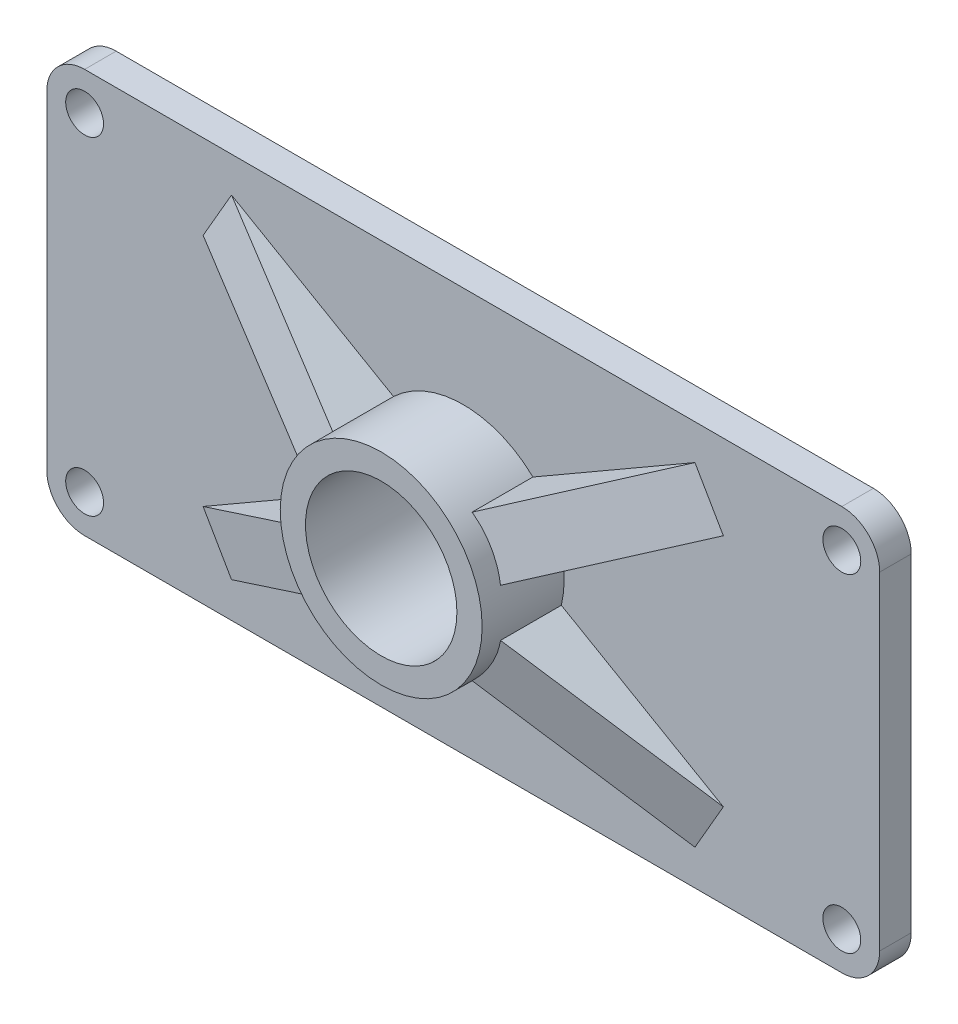
ISO-10303-21;
HEADER;
FILE_DESCRIPTION(('STEP AP214'),'2;1');
FILE_NAME('part.step','',(''),(''),'','','');
FILE_SCHEMA(('AUTOMOTIVE_DESIGN { 1 0 10303 214 1 1 1 1 }'));
ENDSEC;
DATA;
#1=APPLICATION_CONTEXT('core data for automotive mechanical design processes');
#2=APPLICATION_PROTOCOL_DEFINITION('international standard','automotive_design',2000,#1);
#3=PRODUCT_CONTEXT('',#1,'mechanical');
#4=PRODUCT('Part','Part','',(#3));
#5=PRODUCT_RELATED_PRODUCT_CATEGORY('part','',(#4));
#6=PRODUCT_DEFINITION_FORMATION('','',#4);
#7=PRODUCT_DEFINITION_CONTEXT('part definition',#1,'design');
#8=PRODUCT_DEFINITION('design','',#6,#7);
#9=PRODUCT_DEFINITION_SHAPE('','',#8);
#10=(LENGTH_UNIT() NAMED_UNIT(*) SI_UNIT(.MILLI.,.METRE.));
#11=(NAMED_UNIT(*) PLANE_ANGLE_UNIT() SI_UNIT($,.RADIAN.));
#12=(NAMED_UNIT(*) SI_UNIT($,.STERADIAN.) SOLID_ANGLE_UNIT());
#13=UNCERTAINTY_MEASURE_WITH_UNIT(LENGTH_MEASURE(1.E-05),#10,'distance_accuracy_value','');
#14=(GEOMETRIC_REPRESENTATION_CONTEXT(3) GLOBAL_UNCERTAINTY_ASSIGNED_CONTEXT((#13)) GLOBAL_UNIT_ASSIGNED_CONTEXT((#10,
#11,#12)) REPRESENTATION_CONTEXT('',''));
#15=CARTESIAN_POINT('',(0.,0.,0.));
#16=DIRECTION('',(0.,0.,1.));
#17=DIRECTION('',(1.,0.,0.));
#18=AXIS2_PLACEMENT_3D('',#15,#16,#17);
#19=CARTESIAN_POINT('',(0.,32.,5.));
#20=DIRECTION('',(0.,1.,0.));
#21=DIRECTION('',(0.,0.,1.));
#22=AXIS2_PLACEMENT_3D('',#19,#20,#21);
#23=PLANE('',#22);
#24=DIRECTION('',(0.,0.,-1.));
#25=VECTOR('',#24,1.);
#26=CARTESIAN_POINT('',(60.,32.,5.));
#27=LINE('',#26,#25);
#28=CARTESIAN_POINT('',(60.,32.,5.));
#29=VERTEX_POINT('',#28);
#30=CARTESIAN_POINT('',(60.,32.,0.));
#31=VERTEX_POINT('',#30);
#32=EDGE_CURVE('E349',#29,#31,#27,.T.);
#33=ORIENTED_EDGE('',*,*,#32,.T.);
#34=DIRECTION('',(1.,0.,0.));
#35=VECTOR('',#34,1.);
#36=CARTESIAN_POINT('',(0.,32.,0.));
#37=LINE('',#36,#35);
#38=CARTESIAN_POINT('',(-60.,32.,0.));
#39=VERTEX_POINT('',#38);
#40=EDGE_CURVE('E365',#39,#31,#37,.T.);
#41=ORIENTED_EDGE('',*,*,#40,.F.);
#42=DIRECTION('',(0.,0.,-1.));
#43=VECTOR('',#42,1.);
#44=CARTESIAN_POINT('',(-60.,32.,5.));
#45=LINE('',#44,#43);
#46=CARTESIAN_POINT('',(-60.,32.,5.));
#47=VERTEX_POINT('',#46);
#48=EDGE_CURVE('E418',#47,#39,#45,.T.);
#49=ORIENTED_EDGE('',*,*,#48,.F.);
#50=DIRECTION('',(1.,0.,0.));
#51=VECTOR('',#50,1.);
#52=CARTESIAN_POINT('',(0.,32.,5.));
#53=LINE('',#52,#51);
#54=EDGE_CURVE('E323',#47,#29,#53,.T.);
#55=ORIENTED_EDGE('',*,*,#54,.T.);
#56=EDGE_LOOP('',(#33,#41,#49,#55));
#57=FACE_BOUND('',#56,.T.);
#58=ADVANCED_FACE('F49',(#57),#23,.T.);
#59=CARTESIAN_POINT('',(-60.,26.,5.));
#60=DIRECTION('',(0.,0.,-1.));
#61=DIRECTION('',(-1.,0.,0.));
#62=AXIS2_PLACEMENT_3D('',#59,#60,#61);
#63=CYLINDRICAL_SURFACE('',#62,6.);
#64=CARTESIAN_POINT('',(-60.,26.,0.));
#65=DIRECTION('',(0.,0.,1.));
#66=DIRECTION('',(1.,0.,0.));
#67=AXIS2_PLACEMENT_3D('',#64,#65,#66);
#68=CIRCLE('',#67,6.);
#69=CARTESIAN_POINT('',(-66.,26.,0.));
#70=VERTEX_POINT('',#69);
#71=EDGE_CURVE('E368',#39,#70,#68,.T.);
#72=ORIENTED_EDGE('',*,*,#71,.T.);
#73=DIRECTION('',(0.,0.,-1.));
#74=VECTOR('',#73,1.);
#75=CARTESIAN_POINT('',(-66.,26.,5.));
#76=LINE('',#75,#74);
#77=CARTESIAN_POINT('',(-66.,26.,5.));
#78=VERTEX_POINT('',#77);
#79=EDGE_CURVE('E414',#78,#70,#76,.T.);
#80=ORIENTED_EDGE('',*,*,#79,.F.);
#81=CARTESIAN_POINT('',(-60.,26.,5.));
#82=DIRECTION('',(0.,0.,1.));
#83=DIRECTION('',(1.,0.,0.));
#84=AXIS2_PLACEMENT_3D('',#81,#82,#83);
#85=CIRCLE('',#84,6.);
#86=EDGE_CURVE('E326',#47,#78,#85,.T.);
#87=ORIENTED_EDGE('',*,*,#86,.F.);
#88=ORIENTED_EDGE('',*,*,#48,.T.);
#89=EDGE_LOOP('',(#72,#80,#87,#88));
#90=FACE_BOUND('',#89,.T.);
#91=ADVANCED_FACE('F451',(#90),#63,.T.);
#92=CARTESIAN_POINT('',(-66.,0.,5.));
#93=DIRECTION('',(1.,0.,0.));
#94=DIRECTION('',(0.,1.,0.));
#95=AXIS2_PLACEMENT_3D('',#92,#93,#94);
#96=PLANE('',#95);
#97=DIRECTION('',(0.,-1.,0.));
#98=VECTOR('',#97,1.);
#99=CARTESIAN_POINT('',(-66.,0.,0.));
#100=LINE('',#99,#98);
#101=CARTESIAN_POINT('',(-66.,-26.,0.));
#102=VERTEX_POINT('',#101);
#103=EDGE_CURVE('E371',#70,#102,#100,.T.);
#104=ORIENTED_EDGE('',*,*,#103,.T.);
#105=DIRECTION('',(0.,0.,-1.));
#106=VECTOR('',#105,1.);
#107=CARTESIAN_POINT('',(-66.,-26.,5.));
#108=LINE('',#107,#106);
#109=CARTESIAN_POINT('',(-66.,-26.,5.));
#110=VERTEX_POINT('',#109);
#111=EDGE_CURVE('E410',#110,#102,#108,.T.);
#112=ORIENTED_EDGE('',*,*,#111,.F.);
#113=DIRECTION('',(0.,-1.,0.));
#114=VECTOR('',#113,1.);
#115=CARTESIAN_POINT('',(-66.,0.,5.));
#116=LINE('',#115,#114);
#117=EDGE_CURVE('E329',#78,#110,#116,.T.);
#118=ORIENTED_EDGE('',*,*,#117,.F.);
#119=ORIENTED_EDGE('',*,*,#79,.T.);
#120=EDGE_LOOP('',(#104,#112,#118,#119));
#121=FACE_BOUND('',#120,.T.);
#122=ADVANCED_FACE('F459',(#121),#96,.F.);
#123=CARTESIAN_POINT('',(-60.,-26.,5.));
#124=DIRECTION('',(0.,0.,-1.));
#125=DIRECTION('',(-1.,0.,0.));
#126=AXIS2_PLACEMENT_3D('',#123,#124,#125);
#127=CYLINDRICAL_SURFACE('',#126,6.);
#128=DIRECTION('',(0.,0.,-1.));
#129=VECTOR('',#128,1.);
#130=CARTESIAN_POINT('',(-60.,-32.,5.));
#131=LINE('',#130,#129);
#132=CARTESIAN_POINT('',(-60.,-32.,5.));
#133=VERTEX_POINT('',#132);
#134=CARTESIAN_POINT('',(-60.,-32.,0.));
#135=VERTEX_POINT('',#134);
#136=EDGE_CURVE('E406',#133,#135,#131,.T.);
#137=ORIENTED_EDGE('',*,*,#136,.F.);
#138=CARTESIAN_POINT('',(-60.,-26.,5.));
#139=DIRECTION('',(0.,0.,1.));
#140=DIRECTION('',(1.,0.,0.));
#141=AXIS2_PLACEMENT_3D('',#138,#139,#140);
#142=CIRCLE('',#141,6.);
#143=EDGE_CURVE('E333',#110,#133,#142,.T.);
#144=ORIENTED_EDGE('',*,*,#143,.F.);
#145=ORIENTED_EDGE('',*,*,#111,.T.);
#146=CARTESIAN_POINT('',(-60.,-26.,0.));
#147=DIRECTION('',(0.,0.,1.));
#148=DIRECTION('',(1.,0.,0.));
#149=AXIS2_PLACEMENT_3D('',#146,#147,#148);
#150=CIRCLE('',#149,6.);
#151=EDGE_CURVE('E375',#102,#135,#150,.T.);
#152=ORIENTED_EDGE('',*,*,#151,.T.);
#153=EDGE_LOOP('',(#137,#144,#145,#152));
#154=FACE_BOUND('',#153,.T.);
#155=ADVANCED_FACE('F510',(#154),#127,.T.);
#156=CARTESIAN_POINT('',(0.,-32.,5.));
#157=DIRECTION('',(0.,1.,0.));
#158=DIRECTION('',(0.,0.,1.));
#159=AXIS2_PLACEMENT_3D('',#156,#157,#158);
#160=PLANE('',#159);
#161=DIRECTION('',(1.,0.,0.));
#162=VECTOR('',#161,1.);
#163=CARTESIAN_POINT('',(0.,-32.,0.));
#164=LINE('',#163,#162);
#165=CARTESIAN_POINT('',(60.,-32.,0.));
#166=VERTEX_POINT('',#165);
#167=EDGE_CURVE('E378',#135,#166,#164,.T.);
#168=ORIENTED_EDGE('',*,*,#167,.T.);
#169=DIRECTION('',(0.,0.,-1.));
#170=VECTOR('',#169,1.);
#171=CARTESIAN_POINT('',(60.,-32.,5.));
#172=LINE('',#171,#170);
#173=CARTESIAN_POINT('',(60.,-32.,5.));
#174=VERTEX_POINT('',#173);
#175=EDGE_CURVE('E402',#174,#166,#172,.T.);
#176=ORIENTED_EDGE('',*,*,#175,.F.);
#177=DIRECTION('',(1.,0.,0.));
#178=VECTOR('',#177,1.);
#179=CARTESIAN_POINT('',(0.,-32.,5.));
#180=LINE('',#179,#178);
#181=EDGE_CURVE('E336',#133,#174,#180,.T.);
#182=ORIENTED_EDGE('',*,*,#181,.F.);
#183=ORIENTED_EDGE('',*,*,#136,.T.);
#184=EDGE_LOOP('',(#168,#176,#182,#183));
#185=FACE_BOUND('',#184,.T.);
#186=ADVANCED_FACE('F506',(#185),#160,.F.);
#187=CARTESIAN_POINT('',(60.,-26.,5.));
#188=DIRECTION('',(0.,0.,-1.));
#189=DIRECTION('',(-1.,0.,0.));
#190=AXIS2_PLACEMENT_3D('',#187,#188,#189);
#191=CYLINDRICAL_SURFACE('',#190,6.);
#192=CARTESIAN_POINT('',(60.,-26.,0.));
#193=DIRECTION('',(0.,0.,1.));
#194=DIRECTION('',(1.,0.,0.));
#195=AXIS2_PLACEMENT_3D('',#192,#193,#194);
#196=CIRCLE('',#195,6.);
#197=CARTESIAN_POINT('',(66.,-26.,0.));
#198=VERTEX_POINT('',#197);
#199=EDGE_CURVE('E381',#166,#198,#196,.T.);
#200=ORIENTED_EDGE('',*,*,#199,.T.);
#201=DIRECTION('',(0.,0.,-1.));
#202=VECTOR('',#201,1.);
#203=CARTESIAN_POINT('',(66.,-26.,5.));
#204=LINE('',#203,#202);
#205=CARTESIAN_POINT('',(66.,-26.,5.));
#206=VERTEX_POINT('',#205);
#207=EDGE_CURVE('E398',#206,#198,#204,.T.);
#208=ORIENTED_EDGE('',*,*,#207,.F.);
#209=CARTESIAN_POINT('',(60.,-26.,5.));
#210=DIRECTION('',(0.,0.,1.));
#211=DIRECTION('',(1.,0.,0.));
#212=AXIS2_PLACEMENT_3D('',#209,#210,#211);
#213=CIRCLE('',#212,6.);
#214=EDGE_CURVE('E339',#174,#206,#213,.T.);
#215=ORIENTED_EDGE('',*,*,#214,.F.);
#216=ORIENTED_EDGE('',*,*,#175,.T.);
#217=EDGE_LOOP('',(#200,#208,#215,#216));
#218=FACE_BOUND('',#217,.T.);
#219=ADVANCED_FACE('F503',(#218),#191,.T.);
#220=CARTESIAN_POINT('',(66.,0.,5.));
#221=DIRECTION('',(1.,0.,0.));
#222=DIRECTION('',(0.,1.,0.));
#223=AXIS2_PLACEMENT_3D('',#220,#221,#222);
#224=PLANE('',#223);
#225=DIRECTION('',(0.,-1.,0.));
#226=VECTOR('',#225,1.);
#227=CARTESIAN_POINT('',(66.,0.,0.));
#228=LINE('',#227,#226);
#229=CARTESIAN_POINT('',(66.,26.,0.));
#230=VERTEX_POINT('',#229);
#231=EDGE_CURVE('E384',#230,#198,#228,.T.);
#232=ORIENTED_EDGE('',*,*,#231,.F.);
#233=DIRECTION('',(0.,0.,-1.));
#234=VECTOR('',#233,1.);
#235=CARTESIAN_POINT('',(66.,26.,5.));
#236=LINE('',#235,#234);
#237=CARTESIAN_POINT('',(66.,26.,5.));
#238=VERTEX_POINT('',#237);
#239=EDGE_CURVE('E394',#238,#230,#236,.T.);
#240=ORIENTED_EDGE('',*,*,#239,.F.);
#241=DIRECTION('',(0.,-1.,0.));
#242=VECTOR('',#241,1.);
#243=CARTESIAN_POINT('',(66.,0.,5.));
#244=LINE('',#243,#242);
#245=EDGE_CURVE('E342',#238,#206,#244,.T.);
#246=ORIENTED_EDGE('',*,*,#245,.T.);
#247=ORIENTED_EDGE('',*,*,#207,.T.);
#248=EDGE_LOOP('',(#232,#240,#246,#247));
#249=FACE_BOUND('',#248,.T.);
#250=ADVANCED_FACE('F468',(#249),#224,.T.);
#251=CARTESIAN_POINT('',(-60.,26.,5.));
#252=DIRECTION('',(0.,0.,-1.));
#253=DIRECTION('',(-1.,0.,0.));
#254=AXIS2_PLACEMENT_3D('',#251,#252,#253);
#255=CYLINDRICAL_SURFACE('',#254,3.);
#256=CARTESIAN_POINT('',(-60.,26.,0.));
#257=DIRECTION('',(0.,0.,1.));
#258=DIRECTION('',(1.,0.,0.));
#259=AXIS2_PLACEMENT_3D('',#256,#257,#258);
#260=CIRCLE('',#259,3.);
#261=CARTESIAN_POINT('',(-57.,26.,0.));
#262=VERTEX_POINT('',#261);
#263=EDGE_CURVE('E361',#262,#262,#260,.T.);
#264=ORIENTED_EDGE('',*,*,#263,.F.);
#265=EDGE_LOOP('',(#264));
#266=FACE_BOUND('',#265,.T.);
#267=CARTESIAN_POINT('',(-60.,26.,5.));
#268=DIRECTION('',(0.,0.,1.));
#269=DIRECTION('',(1.,0.,0.));
#270=AXIS2_PLACEMENT_3D('',#267,#268,#269);
#271=CIRCLE('',#270,3.);
#272=CARTESIAN_POINT('',(-57.,26.,5.));
#273=VERTEX_POINT('',#272);
#274=EDGE_CURVE('E319',#273,#273,#271,.T.);
#275=ORIENTED_EDGE('',*,*,#274,.T.);
#276=EDGE_LOOP('',(#275));
#277=FACE_BOUND('',#276,.T.);
#278=ADVANCED_FACE('F464',(#266,#277),#255,.F.);
#279=CARTESIAN_POINT('',(60.,26.,5.));
#280=DIRECTION('',(0.,0.,-1.));
#281=DIRECTION('',(-1.,0.,0.));
#282=AXIS2_PLACEMENT_3D('',#279,#280,#281);
#283=CYLINDRICAL_SURFACE('',#282,3.);
#284=CARTESIAN_POINT('',(60.,26.,0.));
#285=DIRECTION('',(0.,0.,1.));
#286=DIRECTION('',(1.,0.,0.));
#287=AXIS2_PLACEMENT_3D('',#284,#285,#286);
#288=CIRCLE('',#287,3.);
#289=CARTESIAN_POINT('',(63.,26.,0.));
#290=VERTEX_POINT('',#289);
#291=EDGE_CURVE('E357',#290,#290,#288,.T.);
#292=ORIENTED_EDGE('',*,*,#291,.F.);
#293=EDGE_LOOP('',(#292));
#294=FACE_BOUND('',#293,.T.);
#295=CARTESIAN_POINT('',(60.,26.,5.));
#296=DIRECTION('',(0.,0.,1.));
#297=DIRECTION('',(1.,0.,0.));
#298=AXIS2_PLACEMENT_3D('',#295,#296,#297);
#299=CIRCLE('',#298,3.);
#300=CARTESIAN_POINT('',(63.,26.,5.));
#301=VERTEX_POINT('',#300);
#302=EDGE_CURVE('E315',#301,#301,#299,.T.);
#303=ORIENTED_EDGE('',*,*,#302,.T.);
#304=EDGE_LOOP('',(#303));
#305=FACE_BOUND('',#304,.T.);
#306=ADVANCED_FACE('F467',(#294,#305),#283,.F.);
#307=CARTESIAN_POINT('',(60.,-26.,5.));
#308=DIRECTION('',(0.,0.,-1.));
#309=DIRECTION('',(-1.,0.,0.));
#310=AXIS2_PLACEMENT_3D('',#307,#308,#309);
#311=CYLINDRICAL_SURFACE('',#310,3.);
#312=CARTESIAN_POINT('',(60.,-26.,0.));
#313=DIRECTION('',(0.,0.,1.));
#314=DIRECTION('',(1.,0.,0.));
#315=AXIS2_PLACEMENT_3D('',#312,#313,#314);
#316=CIRCLE('',#315,3.);
#317=CARTESIAN_POINT('',(63.,-26.,0.));
#318=VERTEX_POINT('',#317);
#319=EDGE_CURVE('E353',#318,#318,#316,.T.);
#320=ORIENTED_EDGE('',*,*,#319,.F.);
#321=EDGE_LOOP('',(#320));
#322=FACE_BOUND('',#321,.T.);
#323=CARTESIAN_POINT('',(60.,-26.,5.));
#324=DIRECTION('',(0.,0.,1.));
#325=DIRECTION('',(1.,0.,0.));
#326=AXIS2_PLACEMENT_3D('',#323,#324,#325);
#327=CIRCLE('',#326,3.);
#328=CARTESIAN_POINT('',(63.,-26.,5.));
#329=VERTEX_POINT('',#328);
#330=EDGE_CURVE('E311',#329,#329,#327,.T.);
#331=ORIENTED_EDGE('',*,*,#330,.T.);
#332=EDGE_LOOP('',(#331));
#333=FACE_BOUND('',#332,.T.);
#334=ADVANCED_FACE('F471',(#322,#333),#311,.F.);
#335=CARTESIAN_POINT('',(-60.,-26.,5.));
#336=DIRECTION('',(0.,0.,-1.));
#337=DIRECTION('',(-1.,0.,0.));
#338=AXIS2_PLACEMENT_3D('',#335,#336,#337);
#339=CYLINDRICAL_SURFACE('',#338,3.);
#340=CARTESIAN_POINT('',(-60.,-26.,0.));
#341=DIRECTION('',(0.,0.,1.));
#342=DIRECTION('',(1.,0.,0.));
#343=AXIS2_PLACEMENT_3D('',#340,#341,#342);
#344=CIRCLE('',#343,3.);
#345=CARTESIAN_POINT('',(-57.,-26.,0.));
#346=VERTEX_POINT('',#345);
#347=EDGE_CURVE('E301',#346,#346,#344,.T.);
#348=ORIENTED_EDGE('',*,*,#347,.F.);
#349=EDGE_LOOP('',(#348));
#350=FACE_BOUND('',#349,.T.);
#351=CARTESIAN_POINT('',(-60.,-26.,5.));
#352=DIRECTION('',(0.,0.,1.));
#353=DIRECTION('',(1.,0.,0.));
#354=AXIS2_PLACEMENT_3D('',#351,#352,#353);
#355=CIRCLE('',#354,3.);
#356=CARTESIAN_POINT('',(-57.,-26.,5.));
#357=VERTEX_POINT('',#356);
#358=EDGE_CURVE('E307',#357,#357,#355,.T.);
#359=ORIENTED_EDGE('',*,*,#358,.T.);
#360=EDGE_LOOP('',(#359));
#361=FACE_BOUND('',#360,.T.);
#362=ADVANCED_FACE('F51',(#350,#361),#339,.F.);
#363=CARTESIAN_POINT('',(60.,26.,5.));
#364=DIRECTION('',(0.,0.,-1.));
#365=DIRECTION('',(-1.,0.,0.));
#366=AXIS2_PLACEMENT_3D('',#363,#364,#365);
#367=CYLINDRICAL_SURFACE('',#366,6.);
#368=CARTESIAN_POINT('',(60.,26.,5.));
#369=DIRECTION('',(0.,0.,1.));
#370=DIRECTION('',(1.,0.,0.));
#371=AXIS2_PLACEMENT_3D('',#368,#369,#370);
#372=CIRCLE('',#371,6.);
#373=EDGE_CURVE('E346',#29,#238,#372,.F.);
#374=ORIENTED_EDGE('',*,*,#373,.T.);
#375=ORIENTED_EDGE('',*,*,#239,.T.);
#376=CARTESIAN_POINT('',(60.,26.,0.));
#377=DIRECTION('',(0.,0.,1.));
#378=DIRECTION('',(1.,0.,0.));
#379=AXIS2_PLACEMENT_3D('',#376,#377,#378);
#380=CIRCLE('',#379,6.);
#381=EDGE_CURVE('E388',#31,#230,#380,.F.);
#382=ORIENTED_EDGE('',*,*,#381,.F.);
#383=ORIENTED_EDGE('',*,*,#32,.F.);
#384=EDGE_LOOP('',(#374,#375,#382,#383));
#385=FACE_BOUND('',#384,.T.);
#386=ADVANCED_FACE('F479',(#385),#367,.T.);
#387=CARTESIAN_POINT('',(0.,0.,5.));
#388=DIRECTION('',(0.,0.,1.));
#389=DIRECTION('',(1.,0.,0.));
#390=AXIS2_PLACEMENT_3D('',#387,#388,#389);
#391=PLANE('',#390);
#392=ORIENTED_EDGE('',*,*,#181,.T.);
#393=ORIENTED_EDGE('',*,*,#214,.T.);
#394=ORIENTED_EDGE('',*,*,#245,.F.);
#395=ORIENTED_EDGE('',*,*,#373,.F.);
#396=ORIENTED_EDGE('',*,*,#54,.F.);
#397=ORIENTED_EDGE('',*,*,#86,.T.);
#398=ORIENTED_EDGE('',*,*,#117,.T.);
#399=ORIENTED_EDGE('',*,*,#143,.T.);
#400=EDGE_LOOP('',(#392,#393,#394,#395,#396,#397,#398,#399));
#401=FACE_BOUND('',#400,.T.);
#402=ORIENTED_EDGE('',*,*,#330,.F.);
#403=EDGE_LOOP('',(#402));
#404=FACE_BOUND('',#403,.T.);
#405=DIRECTION('',(0.500000000000001,0.866025403784438,0.));
#406=VECTOR('',#405,1.);
#407=CARTESIAN_POINT('',(38.9711431702997,-22.5,5.));
#408=LINE('',#407,#406);
#409=CARTESIAN_POINT('',(36.7211431702997,-26.39711431703,5.));
#410=VERTEX_POINT('',#409);
#411=CARTESIAN_POINT('',(41.2211431702997,-18.6028856829701,5.));
#412=VERTEX_POINT('',#411);
#413=EDGE_CURVE('E259',#410,#412,#408,.T.);
#414=ORIENTED_EDGE('',*,*,#413,.F.);
#415=DIRECTION('',(-0.866025403784438,0.500000000000001,0.));
#416=VECTOR('',#415,1.);
#417=CARTESIAN_POINT('',(-2.25,-3.89711431702997,5.));
#418=LINE('',#417,#416);
#419=CARTESIAN_POINT('',(11.0470861469722,-11.574190583422,5.));
#420=VERTEX_POINT('',#419);
#421=EDGE_CURVE('E248',#410,#420,#418,.T.);
#422=ORIENTED_EDGE('',*,*,#421,.T.);
#423=CARTESIAN_POINT('',(0.,0.,5.));
#424=DIRECTION('',(0.,0.,1.));
#425=DIRECTION('',(1.,0.,0.));
#426=AXIS2_PLACEMENT_3D('',#423,#424,#425);
#427=CIRCLE('',#426,16.);
#428=CARTESIAN_POINT('',(-11.0470861469722,-11.574190583422,5.));
#429=VERTEX_POINT('',#428);
#430=EDGE_CURVE('E304',#429,#420,#427,.T.);
#431=ORIENTED_EDGE('',*,*,#430,.F.);
#432=DIRECTION('',(-0.866025403784438,-0.500000000000001,0.));
#433=VECTOR('',#432,1.);
#434=CARTESIAN_POINT('',(2.25,-3.89711431702997,5.));
#435=LINE('',#434,#433);
#436=CARTESIAN_POINT('',(-36.7211431702997,-26.39711431703,5.));
#437=VERTEX_POINT('',#436);
#438=EDGE_CURVE('E275',#429,#437,#435,.T.);
#439=ORIENTED_EDGE('',*,*,#438,.T.);
#440=DIRECTION('',(-0.500000000000001,0.866025403784438,0.));
#441=VECTOR('',#440,1.);
#442=CARTESIAN_POINT('',(-38.9711431702997,-22.5,5.));
#443=LINE('',#442,#441);
#444=CARTESIAN_POINT('',(-41.2211431702997,-18.6028856829701,5.));
#445=VERTEX_POINT('',#444);
#446=EDGE_CURVE('E286',#445,#437,#443,.F.);
#447=ORIENTED_EDGE('',*,*,#446,.F.);
#448=DIRECTION('',(-0.866025403784438,-0.500000000000001,0.));
#449=VECTOR('',#448,1.);
#450=CARTESIAN_POINT('',(-2.25,3.89711431702997,5.));
#451=LINE('',#450,#449);
#452=CARTESIAN_POINT('',(-15.5470861469722,-3.77996194936209,5.));
#453=VERTEX_POINT('',#452);
#454=EDGE_CURVE('E282',#453,#445,#451,.T.);
#455=ORIENTED_EDGE('',*,*,#454,.F.);
#456=CARTESIAN_POINT('',(-15.5470861469722,3.7799619493621,5.));
#457=VERTEX_POINT('',#456);
#458=EDGE_CURVE('E194',#457,#453,#427,.T.);
#459=ORIENTED_EDGE('',*,*,#458,.F.);
#460=DIRECTION('',(0.866025403784438,-0.500000000000001,0.));
#461=VECTOR('',#460,1.);
#462=CARTESIAN_POINT('',(-2.25,-3.89711431702997,5.));
#463=LINE('',#462,#461);
#464=CARTESIAN_POINT('',(-41.2211431702997,18.6028856829701,5.));
#465=VERTEX_POINT('',#464);
#466=EDGE_CURVE('E65',#465,#457,#463,.T.);
#467=ORIENTED_EDGE('',*,*,#466,.F.);
#468=DIRECTION('',(-0.500000000000001,-0.866025403784438,0.));
#469=VECTOR('',#468,1.);
#470=CARTESIAN_POINT('',(-38.9711431702997,22.5,5.));
#471=LINE('',#470,#469);
#472=CARTESIAN_POINT('',(-36.7211431702997,26.39711431703,5.));
#473=VERTEX_POINT('',#472);
#474=EDGE_CURVE('E69',#473,#465,#471,.T.);
#475=ORIENTED_EDGE('',*,*,#474,.F.);
#476=DIRECTION('',(0.866025403784438,-0.500000000000001,0.));
#477=VECTOR('',#476,1.);
#478=CARTESIAN_POINT('',(2.25,3.89711431702997,5.));
#479=LINE('',#478,#477);
#480=CARTESIAN_POINT('',(-11.0470861469722,11.574190583422,5.));
#481=VERTEX_POINT('',#480);
#482=EDGE_CURVE('E196',#473,#481,#479,.T.);
#483=ORIENTED_EDGE('',*,*,#482,.T.);
#484=CARTESIAN_POINT('',(11.0470861469722,11.574190583422,5.));
#485=VERTEX_POINT('',#484);
#486=EDGE_CURVE('E184',#485,#481,#427,.T.);
#487=ORIENTED_EDGE('',*,*,#486,.F.);
#488=DIRECTION('',(0.866025403784438,0.500000000000001,0.));
#489=VECTOR('',#488,1.);
#490=CARTESIAN_POINT('',(-2.25,3.89711431702997,5.));
#491=LINE('',#490,#489);
#492=CARTESIAN_POINT('',(36.7211431702997,26.39711431703,5.));
#493=VERTEX_POINT('',#492);
#494=EDGE_CURVE('E230',#485,#493,#491,.T.);
#495=ORIENTED_EDGE('',*,*,#494,.T.);
#496=DIRECTION('',(0.500000000000001,-0.866025403784438,0.));
#497=VECTOR('',#496,1.);
#498=CARTESIAN_POINT('',(38.9711431702997,22.5,5.));
#499=LINE('',#498,#497);
#500=CARTESIAN_POINT('',(41.2211431702997,18.6028856829701,5.));
#501=VERTEX_POINT('',#500);
#502=EDGE_CURVE('E233',#501,#493,#499,.F.);
#503=ORIENTED_EDGE('',*,*,#502,.F.);
#504=DIRECTION('',(0.866025403784438,0.500000000000001,0.));
#505=VECTOR('',#504,1.);
#506=CARTESIAN_POINT('',(2.25,-3.89711431702997,5.));
#507=LINE('',#506,#505);
#508=CARTESIAN_POINT('',(15.5470861469722,3.77996194936208,5.));
#509=VERTEX_POINT('',#508);
#510=EDGE_CURVE('E224',#509,#501,#507,.T.);
#511=ORIENTED_EDGE('',*,*,#510,.F.);
#512=CARTESIAN_POINT('',(15.5470861469722,-3.77996194936208,5.));
#513=VERTEX_POINT('',#512);
#514=EDGE_CURVE('E193',#513,#509,#427,.T.);
#515=ORIENTED_EDGE('',*,*,#514,.F.);
#516=DIRECTION('',(-0.866025403784438,0.500000000000001,0.));
#517=VECTOR('',#516,1.);
#518=CARTESIAN_POINT('',(2.25,3.89711431702997,5.));
#519=LINE('',#518,#517);
#520=EDGE_CURVE('E256',#412,#513,#519,.T.);
#521=ORIENTED_EDGE('',*,*,#520,.F.);
#522=EDGE_LOOP('',(#414,#422,#431,#439,#447,#455,#459,#467,#475,#483,#487,#495,#503,#511,#515,#521));
#523=FACE_BOUND('',#522,.T.);
#524=ORIENTED_EDGE('',*,*,#358,.F.);
#525=EDGE_LOOP('',(#524));
#526=FACE_BOUND('',#525,.T.);
#527=ORIENTED_EDGE('',*,*,#274,.F.);
#528=EDGE_LOOP('',(#527));
#529=FACE_BOUND('',#528,.T.);
#530=ORIENTED_EDGE('',*,*,#302,.F.);
#531=EDGE_LOOP('',(#530));
#532=FACE_BOUND('',#531,.T.);
#533=ADVANCED_FACE('F197',(#401,#404,#523,#526,#529,#532),#391,.T.);
#534=CARTESIAN_POINT('',(0.,0.,0.));
#535=DIRECTION('',(0.,0.,1.));
#536=DIRECTION('',(1.,0.,0.));
#537=AXIS2_PLACEMENT_3D('',#534,#535,#536);
#538=PLANE('',#537);
#539=CARTESIAN_POINT('',(0.,0.,0.));
#540=DIRECTION('',(0.,0.,1.));
#541=DIRECTION('',(1.,0.,0.));
#542=AXIS2_PLACEMENT_3D('',#539,#540,#541);
#543=CIRCLE('',#542,12.);
#544=CARTESIAN_POINT('',(12.,0.,0.));
#545=VERTEX_POINT('',#544);
#546=EDGE_CURVE('E292',#545,#545,#543,.T.);
#547=ORIENTED_EDGE('',*,*,#546,.T.);
#548=EDGE_LOOP('',(#547));
#549=FACE_BOUND('',#548,.T.);
#550=ORIENTED_EDGE('',*,*,#40,.T.);
#551=ORIENTED_EDGE('',*,*,#381,.T.);
#552=ORIENTED_EDGE('',*,*,#231,.T.);
#553=ORIENTED_EDGE('',*,*,#199,.F.);
#554=ORIENTED_EDGE('',*,*,#167,.F.);
#555=ORIENTED_EDGE('',*,*,#151,.F.);
#556=ORIENTED_EDGE('',*,*,#103,.F.);
#557=ORIENTED_EDGE('',*,*,#71,.F.);
#558=EDGE_LOOP('',(#550,#551,#552,#553,#554,#555,#556,#557));
#559=FACE_BOUND('',#558,.T.);
#560=ORIENTED_EDGE('',*,*,#347,.T.);
#561=EDGE_LOOP('',(#560));
#562=FACE_BOUND('',#561,.T.);
#563=ORIENTED_EDGE('',*,*,#263,.T.);
#564=EDGE_LOOP('',(#563));
#565=FACE_BOUND('',#564,.T.);
#566=ORIENTED_EDGE('',*,*,#319,.T.);
#567=EDGE_LOOP('',(#566));
#568=FACE_BOUND('',#567,.T.);
#569=ORIENTED_EDGE('',*,*,#291,.T.);
#570=EDGE_LOOP('',(#569));
#571=FACE_BOUND('',#570,.T.);
#572=ADVANCED_FACE('F486',(#549,#559,#562,#565,#568,#571),#538,.F.);
#573=CARTESIAN_POINT('',(0.,0.,18.));
#574=DIRECTION('',(0.,0.,-1.));
#575=DIRECTION('',(-1.,0.,0.));
#576=AXIS2_PLACEMENT_3D('',#573,#574,#575);
#577=CYLINDRICAL_SURFACE('',#576,12.);
#578=ORIENTED_EDGE('',*,*,#546,.F.);
#579=EDGE_LOOP('',(#578));
#580=FACE_BOUND('',#579,.T.);
#581=CARTESIAN_POINT('',(0.,0.,18.));
#582=DIRECTION('',(0.,0.,1.));
#583=DIRECTION('',(1.,0.,0.));
#584=AXIS2_PLACEMENT_3D('',#581,#582,#583);
#585=CIRCLE('',#584,12.);
#586=CARTESIAN_POINT('',(12.,0.,18.));
#587=VERTEX_POINT('',#586);
#588=EDGE_CURVE('E293',#587,#587,#585,.T.);
#589=ORIENTED_EDGE('',*,*,#588,.T.);
#590=EDGE_LOOP('',(#589));
#591=FACE_BOUND('',#590,.T.);
#592=ADVANCED_FACE('F492',(#580,#591),#577,.F.);
#593=CARTESIAN_POINT('',(0.,0.,18.));
#594=DIRECTION('',(0.,0.,-1.));
#595=DIRECTION('',(-1.,0.,0.));
#596=AXIS2_PLACEMENT_3D('',#593,#594,#595);
#597=CYLINDRICAL_SURFACE('',#596,16.);
#598=CARTESIAN_POINT('',(0.,0.,18.));
#599=DIRECTION('',(0.,0.,1.));
#600=DIRECTION('',(1.,0.,0.));
#601=AXIS2_PLACEMENT_3D('',#598,#599,#600);
#602=CIRCLE('',#601,16.);
#603=CARTESIAN_POINT('',(16.,0.,18.));
#604=VERTEX_POINT('',#603);
#605=EDGE_CURVE('E297',#604,#604,#602,.T.);
#606=ORIENTED_EDGE('',*,*,#605,.F.);
#607=EDGE_LOOP('',(#606));
#608=FACE_BOUND('',#607,.T.);
#609=DIRECTION('',(0.,0.,-1.));
#610=VECTOR('',#609,1.);
#611=CARTESIAN_POINT('',(11.0470861469722,-11.574190583422,18.));
#612=LINE('',#611,#610);
#613=CARTESIAN_POINT('',(11.0470861469722,-11.574190583422,14.6325197536149));
#614=VERTEX_POINT('',#613);
#615=EDGE_CURVE('E244',#614,#420,#612,.T.);
#616=ORIENTED_EDGE('',*,*,#615,.F.);
#617=CARTESIAN_POINT('',(0.,0.,19.6213863304808));
#618=DIRECTION('',(0.267616567329818,-0.154508497187475,0.951056516295153));
#619=DIRECTION('',(0.823639103546331,-0.475528258147578,-0.309016994374948));
#620=AXIS2_PLACEMENT_3D('',#617,#618,#619);
#621=ELLIPSE('',#620,16.8233955878123,16.);
#622=CARTESIAN_POINT('',(15.5470861469722,-3.77996194936208,14.6325197536149));
#623=VERTEX_POINT('',#622);
#624=EDGE_CURVE('E424',#614,#623,#621,.T.);
#625=ORIENTED_EDGE('',*,*,#624,.T.);
#626=DIRECTION('',(0.,0.,-1.));
#627=VECTOR('',#626,1.);
#628=CARTESIAN_POINT('',(15.5470861469722,-3.77996194936208,18.));
#629=LINE('',#628,#627);
#630=EDGE_CURVE('E252',#623,#513,#629,.T.);
#631=ORIENTED_EDGE('',*,*,#630,.T.);
#632=ORIENTED_EDGE('',*,*,#514,.T.);
#633=DIRECTION('',(0.,0.,-1.));
#634=VECTOR('',#633,1.);
#635=CARTESIAN_POINT('',(15.5470861469722,3.77996194936208,18.));
#636=LINE('',#635,#634);
#637=CARTESIAN_POINT('',(15.5470861469722,3.77996194936208,14.6325197536149));
#638=VERTEX_POINT('',#637);
#639=EDGE_CURVE('E220',#509,#638,#636,.F.);
#640=ORIENTED_EDGE('',*,*,#639,.T.);
#641=CARTESIAN_POINT('',(0.,0.,19.6213863304808));
#642=DIRECTION('',(-0.267616567329818,-0.154508497187475,-0.951056516295153));
#643=DIRECTION('',(0.823639103546331,0.475528258147578,-0.309016994374948));
#644=AXIS2_PLACEMENT_3D('',#641,#642,#643);
#645=ELLIPSE('',#644,16.8233955878123,16.);
#646=CARTESIAN_POINT('',(11.0470861469722,11.574190583422,14.6325197536149));
#647=VERTEX_POINT('',#646);
#648=EDGE_CURVE('E58',#638,#647,#645,.F.);
#649=ORIENTED_EDGE('',*,*,#648,.T.);
#650=DIRECTION('',(0.,0.,-1.));
#651=VECTOR('',#650,1.);
#652=CARTESIAN_POINT('',(11.0470861469722,11.574190583422,18.));
#653=LINE('',#652,#651);
#654=EDGE_CURVE('E190',#485,#647,#653,.F.);
#655=ORIENTED_EDGE('',*,*,#654,.F.);
#656=ORIENTED_EDGE('',*,*,#486,.T.);
#657=DIRECTION('',(0.,0.,-1.));
#658=VECTOR('',#657,1.);
#659=CARTESIAN_POINT('',(-11.0470861469722,11.574190583422,18.));
#660=LINE('',#659,#658);
#661=CARTESIAN_POINT('',(-11.0470861469722,11.574190583422,14.6325197536149));
#662=VERTEX_POINT('',#661);
#663=EDGE_CURVE('E187',#662,#481,#660,.T.);
#664=ORIENTED_EDGE('',*,*,#663,.F.);
#665=CARTESIAN_POINT('',(0.,0.,19.6213863304808));
#666=DIRECTION('',(-0.267616567329818,0.154508497187475,0.951056516295153));
#667=DIRECTION('',(-0.823639103546331,0.475528258147578,-0.309016994374948));
#668=AXIS2_PLACEMENT_3D('',#665,#666,#667);
#669=ELLIPSE('',#668,16.8233955878123,16.);
#670=CARTESIAN_POINT('',(-15.5470861469722,3.7799619493621,14.6325197536149));
#671=VERTEX_POINT('',#670);
#672=EDGE_CURVE('E11',#662,#671,#669,.T.);
#673=ORIENTED_EDGE('',*,*,#672,.T.);
#674=DIRECTION('',(0.,0.,-1.));
#675=VECTOR('',#674,1.);
#676=CARTESIAN_POINT('',(-15.5470861469722,3.7799619493621,18.));
#677=LINE('',#676,#675);
#678=EDGE_CURVE('E209',#671,#457,#677,.T.);
#679=ORIENTED_EDGE('',*,*,#678,.T.);
#680=ORIENTED_EDGE('',*,*,#458,.T.);
#681=DIRECTION('',(0.,0.,-1.));
#682=VECTOR('',#681,1.);
#683=CARTESIAN_POINT('',(-15.5470861469722,-3.77996194936209,18.));
#684=LINE('',#683,#682);
#685=CARTESIAN_POINT('',(-15.5470861469722,-3.77996194936209,14.6325197536149));
#686=VERTEX_POINT('',#685);
#687=EDGE_CURVE('E278',#453,#686,#684,.F.);
#688=ORIENTED_EDGE('',*,*,#687,.T.);
#689=CARTESIAN_POINT('',(0.,0.,19.6213863304808));
#690=DIRECTION('',(0.267616567329818,0.154508497187475,-0.951056516295153));
#691=DIRECTION('',(-0.823639103546331,-0.475528258147578,-0.309016994374948));
#692=AXIS2_PLACEMENT_3D('',#689,#690,#691);
#693=ELLIPSE('',#692,16.8233955878123,16.);
#694=CARTESIAN_POINT('',(-11.0470861469722,-11.574190583422,14.6325197536149));
#695=VERTEX_POINT('',#694);
#696=EDGE_CURVE('E421',#686,#695,#693,.F.);
#697=ORIENTED_EDGE('',*,*,#696,.T.);
#698=DIRECTION('',(0.,0.,-1.));
#699=VECTOR('',#698,1.);
#700=CARTESIAN_POINT('',(-11.0470861469722,-11.574190583422,18.));
#701=LINE('',#700,#699);
#702=EDGE_CURVE('E271',#429,#695,#701,.F.);
#703=ORIENTED_EDGE('',*,*,#702,.F.);
#704=ORIENTED_EDGE('',*,*,#430,.T.);
#705=EDGE_LOOP('',(#616,#625,#631,#632,#640,#649,#655,#656,#664,#673,#679,#680,#688,#697,#703,#704));
#706=FACE_BOUND('',#705,.T.);
#707=ADVANCED_FACE('F185',(#608,#706),#597,.T.);
#708=CARTESIAN_POINT('',(0.,0.,18.));
#709=DIRECTION('',(0.,0.,1.));
#710=DIRECTION('',(1.,0.,0.));
#711=AXIS2_PLACEMENT_3D('',#708,#709,#710);
#712=PLANE('',#711);
#713=ORIENTED_EDGE('',*,*,#605,.T.);
#714=EDGE_LOOP('',(#713));
#715=FACE_BOUND('',#714,.T.);
#716=ORIENTED_EDGE('',*,*,#588,.F.);
#717=EDGE_LOOP('',(#716));
#718=FACE_BOUND('',#717,.T.);
#719=ADVANCED_FACE('F583',(#715,#718),#712,.T.);
#720=CARTESIAN_POINT('',(-13.856406460551,-8.00000000000002,14.4226711907543));
#721=DIRECTION('',(0.267616567329818,0.154508497187475,-0.951056516295153));
#722=DIRECTION('',(-0.823639103546331,-0.475528258147578,-0.309016994374948));
#723=AXIS2_PLACEMENT_3D('',#720,#721,#722);
#724=PLANE('',#723);
#725=DIRECTION('',(-0.823639103546331,-0.475528258147578,-0.309016994374948));
#726=VECTOR('',#725,1.);
#727=CARTESIAN_POINT('',(-16.106406460551,-4.10288568297005,14.4226711907543));
#728=LINE('',#727,#726);
#729=EDGE_CURVE('E267',#686,#445,#728,.T.);
#730=ORIENTED_EDGE('',*,*,#729,.T.);
#731=ORIENTED_EDGE('',*,*,#446,.T.);
#732=DIRECTION('',(-0.823639103546331,-0.475528258147578,-0.309016994374948));
#733=VECTOR('',#732,1.);
#734=CARTESIAN_POINT('',(-11.606406460551,-11.89711431703,14.4226711907543));
#735=LINE('',#734,#733);
#736=EDGE_CURVE('E266',#695,#437,#735,.T.);
#737=ORIENTED_EDGE('',*,*,#736,.F.);
#738=ORIENTED_EDGE('',*,*,#696,.F.);
#739=EDGE_LOOP('',(#730,#731,#737,#738));
#740=FACE_BOUND('',#739,.T.);
#741=ADVANCED_FACE('F578',(#740),#724,.F.);
#742=CARTESIAN_POINT('',(-2.25,3.89711431702997,9.));
#743=DIRECTION('',(-0.500000000000001,0.866025403784438,0.));
#744=DIRECTION('',(-0.866025403784438,-0.500000000000001,0.));
#745=AXIS2_PLACEMENT_3D('',#742,#743,#744);
#746=PLANE('',#745);
#747=ORIENTED_EDGE('',*,*,#687,.F.);
#748=ORIENTED_EDGE('',*,*,#454,.T.);
#749=ORIENTED_EDGE('',*,*,#729,.F.);
#750=EDGE_LOOP('',(#747,#748,#749));
#751=FACE_BOUND('',#750,.T.);
#752=ADVANCED_FACE('F582',(#751),#746,.T.);
#753=CARTESIAN_POINT('',(2.25,-3.89711431702997,9.));
#754=DIRECTION('',(-0.500000000000001,0.866025403784438,0.));
#755=DIRECTION('',(-0.866025403784438,-0.500000000000001,0.));
#756=AXIS2_PLACEMENT_3D('',#753,#754,#755);
#757=PLANE('',#756);
#758=ORIENTED_EDGE('',*,*,#438,.F.);
#759=ORIENTED_EDGE('',*,*,#702,.T.);
#760=ORIENTED_EDGE('',*,*,#736,.T.);
#761=EDGE_LOOP('',(#758,#759,#760));
#762=FACE_BOUND('',#761,.T.);
#763=ADVANCED_FACE('F593',(#762),#757,.F.);
#764=CARTESIAN_POINT('',(13.856406460551,-8.00000000000002,14.4226711907543));
#765=DIRECTION('',(0.267616567329818,-0.154508497187475,0.951056516295153));
#766=DIRECTION('',(0.823639103546331,-0.475528258147578,-0.309016994374948));
#767=AXIS2_PLACEMENT_3D('',#764,#765,#766);
#768=PLANE('',#767);
#769=DIRECTION('',(0.823639103546331,-0.475528258147578,-0.309016994374948));
#770=VECTOR('',#769,1.);
#771=CARTESIAN_POINT('',(11.606406460551,-11.89711431703,14.4226711907543));
#772=LINE('',#771,#770);
#773=EDGE_CURVE('E239',#614,#410,#772,.T.);
#774=ORIENTED_EDGE('',*,*,#773,.T.);
#775=ORIENTED_EDGE('',*,*,#413,.T.);
#776=DIRECTION('',(0.823639103546331,-0.475528258147578,-0.309016994374948));
#777=VECTOR('',#776,1.);
#778=CARTESIAN_POINT('',(16.106406460551,-4.10288568297005,14.4226711907543));
#779=LINE('',#778,#777);
#780=EDGE_CURVE('E240',#623,#412,#779,.T.);
#781=ORIENTED_EDGE('',*,*,#780,.F.);
#782=ORIENTED_EDGE('',*,*,#624,.F.);
#783=EDGE_LOOP('',(#774,#775,#781,#782));
#784=FACE_BOUND('',#783,.T.);
#785=ADVANCED_FACE('F601',(#784),#768,.T.);
#786=CARTESIAN_POINT('',(2.25,3.89711431702997,9.));
#787=DIRECTION('',(0.500000000000001,0.866025403784438,0.));
#788=DIRECTION('',(-0.866025403784438,0.500000000000001,0.));
#789=AXIS2_PLACEMENT_3D('',#786,#787,#788);
#790=PLANE('',#789);
#791=ORIENTED_EDGE('',*,*,#520,.T.);
#792=ORIENTED_EDGE('',*,*,#630,.F.);
#793=ORIENTED_EDGE('',*,*,#780,.T.);
#794=EDGE_LOOP('',(#791,#792,#793));
#795=FACE_BOUND('',#794,.T.);
#796=ADVANCED_FACE('F619',(#795),#790,.T.);
#797=CARTESIAN_POINT('',(-2.25,-3.89711431702997,9.));
#798=DIRECTION('',(0.500000000000001,0.866025403784438,0.));
#799=DIRECTION('',(-0.866025403784438,0.500000000000001,0.));
#800=AXIS2_PLACEMENT_3D('',#797,#798,#799);
#801=PLANE('',#800);
#802=ORIENTED_EDGE('',*,*,#421,.F.);
#803=ORIENTED_EDGE('',*,*,#773,.F.);
#804=ORIENTED_EDGE('',*,*,#615,.T.);
#805=EDGE_LOOP('',(#802,#803,#804));
#806=FACE_BOUND('',#805,.T.);
#807=ADVANCED_FACE('F627',(#806),#801,.F.);
#808=CARTESIAN_POINT('',(13.856406460551,8.00000000000002,14.4226711907543));
#809=DIRECTION('',(-0.267616567329818,-0.154508497187475,-0.951056516295153));
#810=DIRECTION('',(0.823639103546331,0.475528258147578,-0.309016994374948));
#811=AXIS2_PLACEMENT_3D('',#808,#809,#810);
#812=PLANE('',#811);
#813=DIRECTION('',(0.823639103546331,0.475528258147578,-0.309016994374948));
#814=VECTOR('',#813,1.);
#815=CARTESIAN_POINT('',(16.106406460551,4.10288568297005,14.4226711907543));
#816=LINE('',#815,#814);
#817=EDGE_CURVE('E216',#638,#501,#816,.T.);
#818=ORIENTED_EDGE('',*,*,#817,.T.);
#819=ORIENTED_EDGE('',*,*,#502,.T.);
#820=DIRECTION('',(0.823639103546331,0.475528258147578,-0.309016994374948));
#821=VECTOR('',#820,1.);
#822=CARTESIAN_POINT('',(11.606406460551,11.89711431703,14.4226711907543));
#823=LINE('',#822,#821);
#824=EDGE_CURVE('E215',#647,#493,#823,.T.);
#825=ORIENTED_EDGE('',*,*,#824,.F.);
#826=ORIENTED_EDGE('',*,*,#648,.F.);
#827=EDGE_LOOP('',(#818,#819,#825,#826));
#828=FACE_BOUND('',#827,.T.);
#829=ADVANCED_FACE('F435',(#828),#812,.F.);
#830=CARTESIAN_POINT('',(-2.25,3.89711431702997,9.));
#831=DIRECTION('',(0.500000000000001,-0.866025403784438,0.));
#832=DIRECTION('',(0.866025403784438,0.500000000000001,0.));
#833=AXIS2_PLACEMENT_3D('',#830,#831,#832);
#834=PLANE('',#833);
#835=ORIENTED_EDGE('',*,*,#494,.F.);
#836=ORIENTED_EDGE('',*,*,#654,.T.);
#837=ORIENTED_EDGE('',*,*,#824,.T.);
#838=EDGE_LOOP('',(#835,#836,#837));
#839=FACE_BOUND('',#838,.T.);
#840=ADVANCED_FACE('F434',(#839),#834,.F.);
#841=CARTESIAN_POINT('',(2.25,-3.89711431702997,9.));
#842=DIRECTION('',(0.500000000000001,-0.866025403784438,0.));
#843=DIRECTION('',(0.866025403784438,0.500000000000001,0.));
#844=AXIS2_PLACEMENT_3D('',#841,#842,#843);
#845=PLANE('',#844);
#846=ORIENTED_EDGE('',*,*,#639,.F.);
#847=ORIENTED_EDGE('',*,*,#510,.T.);
#848=ORIENTED_EDGE('',*,*,#817,.F.);
#849=EDGE_LOOP('',(#846,#847,#848));
#850=FACE_BOUND('',#849,.T.);
#851=ADVANCED_FACE('F438',(#850),#845,.T.);
#852=CARTESIAN_POINT('',(-13.856406460551,8.00000000000002,14.4226711907543));
#853=DIRECTION('',(-0.267616567329818,0.154508497187475,0.951056516295153));
#854=DIRECTION('',(-0.823639103546331,0.475528258147578,-0.309016994374948));
#855=AXIS2_PLACEMENT_3D('',#852,#853,#854);
#856=PLANE('',#855);
#857=DIRECTION('',(-0.823639103546331,0.475528258147578,-0.309016994374948));
#858=VECTOR('',#857,1.);
#859=CARTESIAN_POINT('',(-11.606406460551,11.89711431703,14.4226711907543));
#860=LINE('',#859,#858);
#861=EDGE_CURVE('E205',#662,#473,#860,.T.);
#862=ORIENTED_EDGE('',*,*,#861,.T.);
#863=ORIENTED_EDGE('',*,*,#474,.T.);
#864=DIRECTION('',(-0.823639103546331,0.475528258147578,-0.309016994374948));
#865=VECTOR('',#864,1.);
#866=CARTESIAN_POINT('',(-16.106406460551,4.10288568297005,14.4226711907543));
#867=LINE('',#866,#865);
#868=EDGE_CURVE('E687',#671,#465,#867,.T.);
#869=ORIENTED_EDGE('',*,*,#868,.F.);
#870=ORIENTED_EDGE('',*,*,#672,.F.);
#871=EDGE_LOOP('',(#862,#863,#869,#870));
#872=FACE_BOUND('',#871,.T.);
#873=ADVANCED_FACE('F440',(#872),#856,.T.);
#874=CARTESIAN_POINT('',(-2.25,-3.89711431702997,9.));
#875=DIRECTION('',(-0.500000000000001,-0.866025403784438,0.));
#876=DIRECTION('',(0.866025403784438,-0.500000000000001,0.));
#877=AXIS2_PLACEMENT_3D('',#874,#875,#876);
#878=PLANE('',#877);
#879=ORIENTED_EDGE('',*,*,#466,.T.);
#880=ORIENTED_EDGE('',*,*,#678,.F.);
#881=ORIENTED_EDGE('',*,*,#868,.T.);
#882=EDGE_LOOP('',(#879,#880,#881));
#883=FACE_BOUND('',#882,.T.);
#884=ADVANCED_FACE('F446',(#883),#878,.T.);
#885=CARTESIAN_POINT('',(2.25,3.89711431702997,9.));
#886=DIRECTION('',(-0.500000000000001,-0.866025403784438,0.));
#887=DIRECTION('',(0.866025403784438,-0.500000000000001,0.));
#888=AXIS2_PLACEMENT_3D('',#885,#886,#887);
#889=PLANE('',#888);
#890=ORIENTED_EDGE('',*,*,#482,.F.);
#891=ORIENTED_EDGE('',*,*,#861,.F.);
#892=ORIENTED_EDGE('',*,*,#663,.T.);
#893=EDGE_LOOP('',(#890,#891,#892));
#894=FACE_BOUND('',#893,.T.);
#895=ADVANCED_FACE('F204',(#894),#889,.F.);
#896=CLOSED_SHELL('',(#58,#91,#122,#155,#186,#219,#250,#278,#306,#334,#362,#386,#533,#572,#592,
#707,#719,#741,#752,#763,#785,#796,#807,#829,#840,#851,#873,#884,#895));
#897=MANIFOLD_SOLID_BREP('B2',#896);
#898=ADVANCED_BREP_SHAPE_REPRESENTATION('',(#18,#897),#14);
#899=SHAPE_DEFINITION_REPRESENTATION(#9,#898);
ENDSEC;
END-ISO-10303-21;
